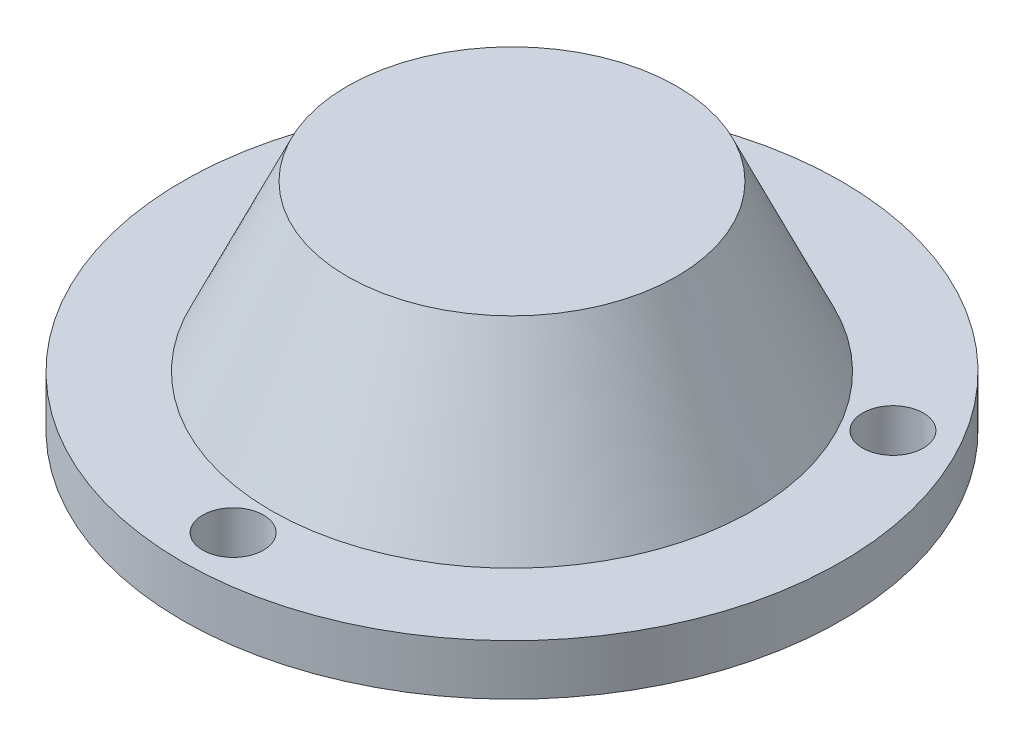
ISO-10303-21;
HEADER;
FILE_DESCRIPTION(('STEP AP214'),'2;1');
FILE_NAME('part.step','',(''),(''),'','','');
FILE_SCHEMA(('AUTOMOTIVE_DESIGN { 1 0 10303 214 1 1 1 1 }'));
ENDSEC;
DATA;
#1=APPLICATION_CONTEXT('core data for automotive mechanical design processes');
#2=APPLICATION_PROTOCOL_DEFINITION('international standard','automotive_design',2000,#1);
#3=PRODUCT_CONTEXT('',#1,'mechanical');
#4=PRODUCT('Part','Part','',(#3));
#5=PRODUCT_RELATED_PRODUCT_CATEGORY('part','',(#4));
#6=PRODUCT_DEFINITION_FORMATION('','',#4);
#7=PRODUCT_DEFINITION_CONTEXT('part definition',#1,'design');
#8=PRODUCT_DEFINITION('design','',#6,#7);
#9=PRODUCT_DEFINITION_SHAPE('','',#8);
#10=(LENGTH_UNIT() NAMED_UNIT(*) SI_UNIT(.MILLI.,.METRE.));
#11=(NAMED_UNIT(*) PLANE_ANGLE_UNIT() SI_UNIT($,.RADIAN.));
#12=(NAMED_UNIT(*) SI_UNIT($,.STERADIAN.) SOLID_ANGLE_UNIT());
#13=UNCERTAINTY_MEASURE_WITH_UNIT(LENGTH_MEASURE(1.E-05),#10,'distance_accuracy_value','');
#14=(GEOMETRIC_REPRESENTATION_CONTEXT(3) GLOBAL_UNCERTAINTY_ASSIGNED_CONTEXT((#13)) GLOBAL_UNIT_ASSIGNED_CONTEXT((#10,
#11,#12)) REPRESENTATION_CONTEXT('',''));
#15=CARTESIAN_POINT('',(0.,0.,0.));
#16=DIRECTION('',(0.,0.,1.));
#17=DIRECTION('',(1.,0.,0.));
#18=AXIS2_PLACEMENT_3D('',#15,#16,#17);
#19=CARTESIAN_POINT('',(0.,8.5,0.));
#20=DIRECTION('',(0.,1.,0.));
#21=DIRECTION('',(0.,0.,1.));
#22=AXIS2_PLACEMENT_3D('',#19,#20,#21);
#23=PLANE('',#22);
#24=CARTESIAN_POINT('',(0.,8.5,0.));
#25=DIRECTION('',(0.,1.,0.));
#26=DIRECTION('',(0.,0.,1.));
#27=AXIS2_PLACEMENT_3D('',#24,#25,#26);
#28=CIRCLE('',#27,6.5);
#29=CARTESIAN_POINT('',(0.,8.5,6.5));
#30=VERTEX_POINT('',#29);
#31=EDGE_CURVE('E65',#30,#30,#28,.T.);
#32=ORIENTED_EDGE('',*,*,#31,.T.);
#33=EDGE_LOOP('',(#32));
#34=FACE_BOUND('',#33,.T.);
#35=ADVANCED_FACE('F40',(#34),#23,.T.);
#36=CARTESIAN_POINT('',(0.,-0.7,0.));
#37=DIRECTION('',(0.,1.,0.));
#38=DIRECTION('',(1.,0.,0.));
#39=AXIS2_PLACEMENT_3D('',#36,#37,#38);
#40=SPHERICAL_SURFACE('',#39,6.3);
#41=CARTESIAN_POINT('',(0.,-3.20785080754047,0.));
#42=DIRECTION('',(0.,1.,0.));
#43=DIRECTION('',(0.,0.,1.));
#44=AXIS2_PLACEMENT_3D('',#41,#42,#43);
#45=CIRCLE('',#44,5.7793325157079);
#46=CARTESIAN_POINT('',(0.,-3.20785080754047,5.7793325157079));
#47=VERTEX_POINT('',#46);
#48=EDGE_CURVE('E53',#47,#47,#45,.T.);
#49=ORIENTED_EDGE('',*,*,#48,.F.);
#50=EDGE_LOOP('',(#49));
#51=FACE_BOUND('',#50,.T.);
#52=ADVANCED_FACE('F92',(#51),#40,.T.);
#53=CARTESIAN_POINT('',(0.,-3.20785080754047,0.));
#54=DIRECTION('',(0.,1.,0.));
#55=DIRECTION('',(0.,0.,1.));
#56=AXIS2_PLACEMENT_3D('',#53,#54,#55);
#57=PLANE('',#56);
#58=CARTESIAN_POINT('',(0.,-3.20785080754047,0.));
#59=DIRECTION('',(0.,1.,0.));
#60=DIRECTION('',(0.,0.,1.));
#61=AXIS2_PLACEMENT_3D('',#58,#59,#60);
#62=CIRCLE('',#61,5.99672279892264);
#63=CARTESIAN_POINT('',(0.,-3.20785080754047,5.99672279892264));
#64=VERTEX_POINT('',#63);
#65=EDGE_CURVE('E85',#64,#64,#62,.T.);
#66=ORIENTED_EDGE('',*,*,#65,.F.);
#67=EDGE_LOOP('',(#66));
#68=FACE_BOUND('',#67,.T.);
#69=ORIENTED_EDGE('',*,*,#48,.T.);
#70=EDGE_LOOP('',(#69));
#71=FACE_BOUND('',#70,.T.);
#72=ADVANCED_FACE('F90',(#68,#71),#57,.F.);
#73=CARTESIAN_POINT('',(0.,-1.76885759394497,0.));
#74=DIRECTION('',(0.,1.,0.));
#75=DIRECTION('',(0.,0.,1.));
#76=AXIS2_PLACEMENT_3D('',#73,#74,#75);
#77=DEGENERATE_TOROIDAL_SURFACE('',#76,0.341991465912625,6.5,.F.);
#78=CARTESIAN_POINT('',(0.,-2.61121818756157,0.));
#79=DIRECTION('',(0.,1.,0.));
#80=DIRECTION('',(0.,0.,1.));
#81=AXIS2_PLACEMENT_3D('',#78,#79,#80);
#82=CIRCLE('',#81,6.1031950038741);
#83=CARTESIAN_POINT('',(0.,-2.61121818756157,6.1031950038741));
#84=VERTEX_POINT('',#83);
#85=EDGE_CURVE('E10',#84,#84,#82,.F.);
#86=ORIENTED_EDGE('',*,*,#85,.T.);
#87=EDGE_LOOP('',(#86));
#88=FACE_BOUND('',#87,.T.);
#89=ORIENTED_EDGE('',*,*,#65,.T.);
#90=EDGE_LOOP('',(#89));
#91=FACE_BOUND('',#90,.T.);
#92=ADVANCED_FACE('F99',(#88,#91),#77,.F.);
#93=CARTESIAN_POINT('',(0.,0.,0.));
#94=DIRECTION('',(0.,-1.,0.));
#95=DIRECTION('',(0.,0.,-1.));
#96=AXIS2_PLACEMENT_3D('',#93,#94,#95);
#97=PLANE('',#96);
#98=CARTESIAN_POINT('',(0.,0.,11.));
#99=DIRECTION('',(0.,-1.,0.));
#100=DIRECTION('',(0.,0.,-1.));
#101=AXIS2_PLACEMENT_3D('',#98,#99,#100);
#102=CIRCLE('',#101,1.2);
#103=CARTESIAN_POINT('',(0.,0.,9.8));
#104=VERTEX_POINT('',#103);
#105=EDGE_CURVE('E60',#104,#104,#102,.T.);
#106=ORIENTED_EDGE('',*,*,#105,.F.);
#107=EDGE_LOOP('',(#106));
#108=FACE_BOUND('',#107,.T.);
#109=CARTESIAN_POINT('',(9.52627944162953,0.,-5.49999999999959));
#110=DIRECTION('',(0.,-1.,0.));
#111=DIRECTION('',(0.,0.,-1.));
#112=AXIS2_PLACEMENT_3D('',#109,#110,#111);
#113=CIRCLE('',#112,1.20000000000061);
#114=CARTESIAN_POINT('',(9.52627944162953,0.,-6.7000000000002));
#115=VERTEX_POINT('',#114);
#116=EDGE_CURVE('E135',#115,#115,#113,.T.);
#117=ORIENTED_EDGE('',*,*,#116,.F.);
#118=EDGE_LOOP('',(#117));
#119=FACE_BOUND('',#118,.T.);
#120=CARTESIAN_POINT('',(-9.52627944162812,0.,-5.50000000000041));
#121=DIRECTION('',(0.,-1.,0.));
#122=DIRECTION('',(0.,0.,-1.));
#123=AXIS2_PLACEMENT_3D('',#120,#121,#122);
#124=CIRCLE('',#123,1.20000000000089);
#125=CARTESIAN_POINT('',(-9.52627944162812,0.,-6.7000000000013));
#126=VERTEX_POINT('',#125);
#127=EDGE_CURVE('E77',#126,#126,#124,.T.);
#128=ORIENTED_EDGE('',*,*,#127,.F.);
#129=EDGE_LOOP('',(#128));
#130=FACE_BOUND('',#129,.T.);
#131=CARTESIAN_POINT('',(0.,0.,0.));
#132=DIRECTION('',(0.,-1.,0.));
#133=DIRECTION('',(0.,0.,-1.));
#134=AXIS2_PLACEMENT_3D('',#131,#132,#133);
#135=CIRCLE('',#134,9.07789645146798);
#136=CARTESIAN_POINT('',(0.,0.,-9.07789645146798));
#137=VERTEX_POINT('',#136);
#138=EDGE_CURVE('E48',#137,#137,#135,.F.);
#139=ORIENTED_EDGE('',*,*,#138,.T.);
#140=EDGE_LOOP('',(#139));
#141=FACE_BOUND('',#140,.T.);
#142=CARTESIAN_POINT('',(0.,0.,0.));
#143=DIRECTION('',(0.,1.,0.));
#144=DIRECTION('',(0.,0.,1.));
#145=AXIS2_PLACEMENT_3D('',#142,#143,#144);
#146=CIRCLE('',#145,13.);
#147=CARTESIAN_POINT('',(0.,0.,13.));
#148=VERTEX_POINT('',#147);
#149=EDGE_CURVE('E82',#148,#148,#146,.T.);
#150=ORIENTED_EDGE('',*,*,#149,.F.);
#151=EDGE_LOOP('',(#150));
#152=FACE_BOUND('',#151,.T.);
#153=ADVANCED_FACE('F105',(#108,#119,#130,#141,#152),#97,.T.);
#154=CARTESIAN_POINT('',(0.,8.5,0.));
#155=DIRECTION('',(0.,1.,0.));
#156=DIRECTION('',(0.,0.,1.));
#157=AXIS2_PLACEMENT_3D('',#154,#155,#156);
#158=CYLINDRICAL_SURFACE('',#157,13.);
#159=ORIENTED_EDGE('',*,*,#149,.T.);
#160=EDGE_LOOP('',(#159));
#161=FACE_BOUND('',#160,.T.);
#162=CARTESIAN_POINT('',(0.,2.,0.));
#163=DIRECTION('',(0.,1.,0.));
#164=DIRECTION('',(0.,0.,1.));
#165=AXIS2_PLACEMENT_3D('',#162,#163,#164);
#166=CIRCLE('',#165,13.);
#167=CARTESIAN_POINT('',(0.,2.,13.));
#168=VERTEX_POINT('',#167);
#169=EDGE_CURVE('E74',#168,#168,#166,.T.);
#170=ORIENTED_EDGE('',*,*,#169,.F.);
#171=EDGE_LOOP('',(#170));
#172=FACE_BOUND('',#171,.T.);
#173=ADVANCED_FACE('F108',(#161,#172),#158,.T.);
#174=CARTESIAN_POINT('',(0.,2.,0.));
#175=DIRECTION('',(0.,1.,0.));
#176=DIRECTION('',(0.,0.,1.));
#177=AXIS2_PLACEMENT_3D('',#174,#175,#176);
#178=PLANE('',#177);
#179=CARTESIAN_POINT('',(0.,2.,11.));
#180=DIRECTION('',(0.,1.,0.));
#181=DIRECTION('',(0.,0.,1.));
#182=AXIS2_PLACEMENT_3D('',#179,#180,#181);
#183=CIRCLE('',#182,1.2);
#184=CARTESIAN_POINT('',(0.,2.,12.2));
#185=VERTEX_POINT('',#184);
#186=EDGE_CURVE('E44',#185,#185,#183,.T.);
#187=ORIENTED_EDGE('',*,*,#186,.F.);
#188=EDGE_LOOP('',(#187));
#189=FACE_BOUND('',#188,.T.);
#190=CARTESIAN_POINT('',(9.52627944162953,2.,-5.49999999999959));
#191=DIRECTION('',(0.,1.,0.));
#192=DIRECTION('',(0.,0.,1.));
#193=AXIS2_PLACEMENT_3D('',#190,#191,#192);
#194=CIRCLE('',#193,1.20000000000061);
#195=CARTESIAN_POINT('',(9.52627944162953,2.,-4.29999999999899));
#196=VERTEX_POINT('',#195);
#197=EDGE_CURVE('E59',#196,#196,#194,.T.);
#198=ORIENTED_EDGE('',*,*,#197,.F.);
#199=EDGE_LOOP('',(#198));
#200=FACE_BOUND('',#199,.T.);
#201=CARTESIAN_POINT('',(-9.52627944162812,2.,-5.50000000000041));
#202=DIRECTION('',(0.,1.,0.));
#203=DIRECTION('',(0.,0.,1.));
#204=AXIS2_PLACEMENT_3D('',#201,#202,#203);
#205=CIRCLE('',#204,1.20000000000089);
#206=CARTESIAN_POINT('',(-9.52627944162812,2.,-4.29999999999952));
#207=VERTEX_POINT('',#206);
#208=EDGE_CURVE('E57',#207,#207,#205,.T.);
#209=ORIENTED_EDGE('',*,*,#208,.F.);
#210=EDGE_LOOP('',(#209));
#211=FACE_BOUND('',#210,.T.);
#212=ORIENTED_EDGE('',*,*,#169,.T.);
#213=EDGE_LOOP('',(#212));
#214=FACE_BOUND('',#213,.T.);
#215=CARTESIAN_POINT('',(0.,2.,0.));
#216=DIRECTION('',(0.,1.,0.));
#217=DIRECTION('',(0.,0.,1.));
#218=AXIS2_PLACEMENT_3D('',#215,#216,#217);
#219=CIRCLE('',#218,9.5);
#220=CARTESIAN_POINT('',(0.,2.,9.5));
#221=VERTEX_POINT('',#220);
#222=EDGE_CURVE('E69',#221,#221,#219,.T.);
#223=ORIENTED_EDGE('',*,*,#222,.F.);
#224=EDGE_LOOP('',(#223));
#225=FACE_BOUND('',#224,.T.);
#226=ADVANCED_FACE('F112',(#189,#200,#211,#214,#225),#178,.T.);
#227=CARTESIAN_POINT('',(0.,8.5,0.));
#228=DIRECTION('',(0.,-1.,0.));
#229=DIRECTION('',(0.,0.,-1.));
#230=AXIS2_PLACEMENT_3D('',#227,#228,#229);
#231=CONICAL_SURFACE('',#230,6.5,0.432407775570538);
#232=ORIENTED_EDGE('',*,*,#222,.T.);
#233=EDGE_LOOP('',(#232));
#234=FACE_BOUND('',#233,.T.);
#235=ORIENTED_EDGE('',*,*,#31,.F.);
#236=EDGE_LOOP('',(#235));
#237=FACE_BOUND('',#236,.T.);
#238=ADVANCED_FACE('F116',(#234,#237),#231,.T.);
#239=CARTESIAN_POINT('',(0.,-3.,0.));
#240=DIRECTION('',(0.,-1.,0.));
#241=DIRECTION('',(0.,0.,-1.));
#242=AXIS2_PLACEMENT_3D('',#239,#240,#241);
#243=TOROIDAL_SURFACE('',#242,9.07789645146798,3.);
#244=ORIENTED_EDGE('',*,*,#85,.F.);
#245=EDGE_LOOP('',(#244));
#246=FACE_BOUND('',#245,.T.);
#247=ORIENTED_EDGE('',*,*,#138,.F.);
#248=EDGE_LOOP('',(#247));
#249=FACE_BOUND('',#248,.T.);
#250=ADVANCED_FACE('F42',(#246,#249),#243,.F.);
#251=CARTESIAN_POINT('',(-9.52627944162812,10.,-5.50000000000041));
#252=DIRECTION('',(0.,-1.,0.));
#253=DIRECTION('',(0.,0.,-1.));
#254=AXIS2_PLACEMENT_3D('',#251,#252,#253);
#255=CYLINDRICAL_SURFACE('',#254,1.20000000000089);
#256=ORIENTED_EDGE('',*,*,#208,.T.);
#257=EDGE_LOOP('',(#256));
#258=FACE_BOUND('',#257,.T.);
#259=ORIENTED_EDGE('',*,*,#127,.T.);
#260=EDGE_LOOP('',(#259));
#261=FACE_BOUND('',#260,.T.);
#262=ADVANCED_FACE('F121',(#258,#261),#255,.F.);
#263=CARTESIAN_POINT('',(9.52627944162953,10.,-5.49999999999959));
#264=DIRECTION('',(0.,-1.,0.));
#265=DIRECTION('',(0.,0.,-1.));
#266=AXIS2_PLACEMENT_3D('',#263,#264,#265);
#267=CYLINDRICAL_SURFACE('',#266,1.20000000000061);
#268=ORIENTED_EDGE('',*,*,#197,.T.);
#269=EDGE_LOOP('',(#268));
#270=FACE_BOUND('',#269,.T.);
#271=ORIENTED_EDGE('',*,*,#116,.T.);
#272=EDGE_LOOP('',(#271));
#273=FACE_BOUND('',#272,.T.);
#274=ADVANCED_FACE('F124',(#270,#273),#267,.F.);
#275=CARTESIAN_POINT('',(0.,10.,11.));
#276=DIRECTION('',(0.,-1.,0.));
#277=DIRECTION('',(0.,0.,-1.));
#278=AXIS2_PLACEMENT_3D('',#275,#276,#277);
#279=CYLINDRICAL_SURFACE('',#278,1.2);
#280=ORIENTED_EDGE('',*,*,#186,.T.);
#281=EDGE_LOOP('',(#280));
#282=FACE_BOUND('',#281,.T.);
#283=ORIENTED_EDGE('',*,*,#105,.T.);
#284=EDGE_LOOP('',(#283));
#285=FACE_BOUND('',#284,.T.);
#286=ADVANCED_FACE('F128',(#282,#285),#279,.F.);
#287=CLOSED_SHELL('',(#35,#52,#72,#92,#153,#173,#226,#238,#250,#262,#274,#286));
#288=MANIFOLD_SOLID_BREP('B2',#287);
#289=ADVANCED_BREP_SHAPE_REPRESENTATION('',(#18,#288),#14);
#290=SHAPE_DEFINITION_REPRESENTATION(#9,#289);
ENDSEC;
END-ISO-10303-21;
